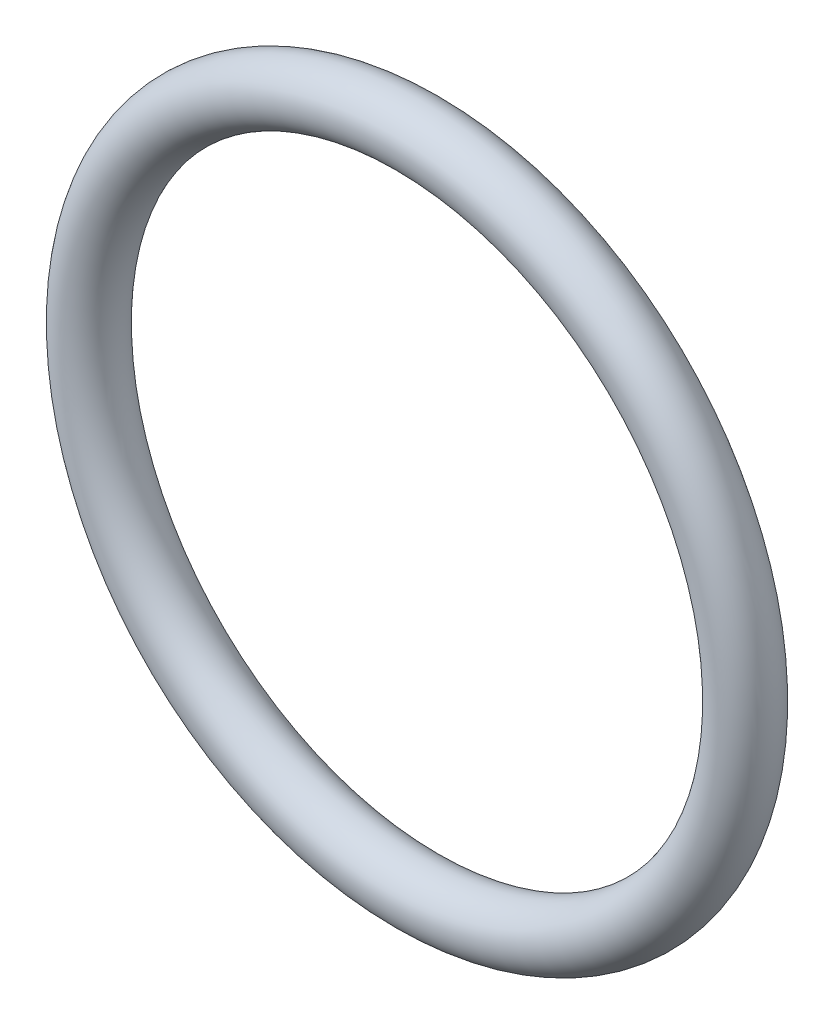
ISO-10303-21;
HEADER;
FILE_DESCRIPTION(('STEP AP214'),'2;1');
FILE_NAME('part.step','',(''),(''),'','','');
FILE_SCHEMA(('AUTOMOTIVE_DESIGN { 1 0 10303 214 1 1 1 1 }'));
ENDSEC;
DATA;
#1=APPLICATION_CONTEXT('core data for automotive mechanical design processes');
#2=APPLICATION_PROTOCOL_DEFINITION('international standard','automotive_design',2000,#1);
#3=PRODUCT_CONTEXT('',#1,'mechanical');
#4=PRODUCT('Part','Part','',(#3));
#5=PRODUCT_RELATED_PRODUCT_CATEGORY('part','',(#4));
#6=PRODUCT_DEFINITION_FORMATION('','',#4);
#7=PRODUCT_DEFINITION_CONTEXT('part definition',#1,'design');
#8=PRODUCT_DEFINITION('design','',#6,#7);
#9=PRODUCT_DEFINITION_SHAPE('','',#8);
#10=(LENGTH_UNIT() NAMED_UNIT(*) SI_UNIT(.MILLI.,.METRE.));
#11=(NAMED_UNIT(*) PLANE_ANGLE_UNIT() SI_UNIT($,.RADIAN.));
#12=(NAMED_UNIT(*) SI_UNIT($,.STERADIAN.) SOLID_ANGLE_UNIT());
#13=UNCERTAINTY_MEASURE_WITH_UNIT(LENGTH_MEASURE(1.E-05),#10,'distance_accuracy_value','');
#14=(GEOMETRIC_REPRESENTATION_CONTEXT(3) GLOBAL_UNCERTAINTY_ASSIGNED_CONTEXT((#13)) GLOBAL_UNIT_ASSIGNED_CONTEXT((#10,
#11,#12)) REPRESENTATION_CONTEXT('',''));
#15=CARTESIAN_POINT('',(0.,0.,0.));
#16=DIRECTION('',(0.,0.,1.));
#17=DIRECTION('',(1.,0.,0.));
#18=AXIS2_PLACEMENT_3D('',#15,#16,#17);
#19=CARTESIAN_POINT('',(0.,0.,0.));
#20=DIRECTION('',(0.,0.,1.));
#21=DIRECTION('',(0.,-1.,0.));
#22=AXIS2_PLACEMENT_3D('',#19,#20,#21);
#23=TOROIDAL_SURFACE('',#22,38.1,3.4925);
#24=CARTESIAN_POINT('',(0.,-41.5925,0.));
#25=VERTEX_POINT('',#24);
#26=VERTEX_LOOP('',#25);
#27=FACE_BOUND('',#26,.T.);
#28=ADVANCED_FACE('F40',(#27),#23,.T.);
#29=CLOSED_SHELL('',(#28));
#30=MANIFOLD_SOLID_BREP('B2',#29);
#31=ADVANCED_BREP_SHAPE_REPRESENTATION('',(#18,#30),#14);
#32=SHAPE_DEFINITION_REPRESENTATION(#9,#31);
ENDSEC;
END-ISO-10303-21;
